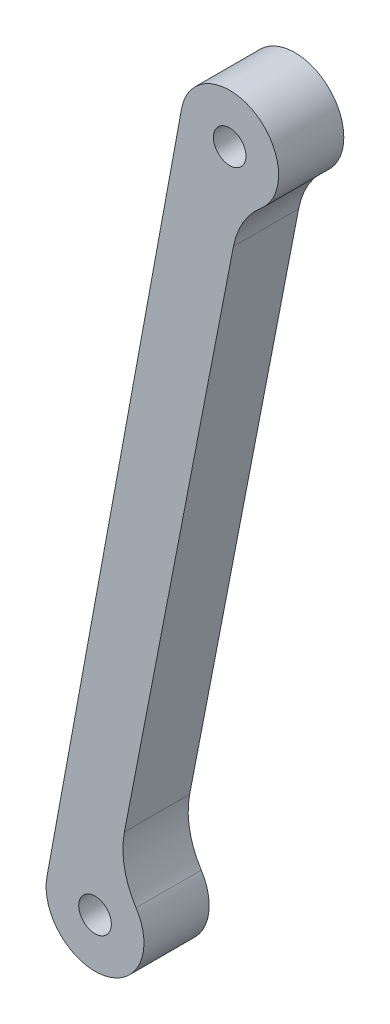
ISO-10303-21;
HEADER;
FILE_DESCRIPTION(('STEP AP214'),'2;1');
FILE_NAME('part.step','',(''),(''),'','','');
FILE_SCHEMA(('AUTOMOTIVE_DESIGN { 1 0 10303 214 1 1 1 1 }'));
ENDSEC;
DATA;
#1=APPLICATION_CONTEXT('core data for automotive mechanical design processes');
#2=APPLICATION_PROTOCOL_DEFINITION('international standard','automotive_design',2000,#1);
#3=PRODUCT_CONTEXT('',#1,'mechanical');
#4=PRODUCT('Part','Part','',(#3));
#5=PRODUCT_RELATED_PRODUCT_CATEGORY('part','',(#4));
#6=PRODUCT_DEFINITION_FORMATION('','',#4);
#7=PRODUCT_DEFINITION_CONTEXT('part definition',#1,'design');
#8=PRODUCT_DEFINITION('design','',#6,#7);
#9=PRODUCT_DEFINITION_SHAPE('','',#8);
#10=(LENGTH_UNIT() NAMED_UNIT(*) SI_UNIT(.MILLI.,.METRE.));
#11=(NAMED_UNIT(*) PLANE_ANGLE_UNIT() SI_UNIT($,.RADIAN.));
#12=(NAMED_UNIT(*) SI_UNIT($,.STERADIAN.) SOLID_ANGLE_UNIT());
#13=UNCERTAINTY_MEASURE_WITH_UNIT(LENGTH_MEASURE(1.E-05),#10,'distance_accuracy_value','');
#14=(GEOMETRIC_REPRESENTATION_CONTEXT(3) GLOBAL_UNCERTAINTY_ASSIGNED_CONTEXT((#13)) GLOBAL_UNIT_ASSIGNED_CONTEXT((#10,
#11,#12)) REPRESENTATION_CONTEXT('',''));
#15=CARTESIAN_POINT('',(0.,0.,0.));
#16=DIRECTION('',(0.,0.,1.));
#17=DIRECTION('',(1.,0.,0.));
#18=AXIS2_PLACEMENT_3D('',#15,#16,#17);
#19=CARTESIAN_POINT('',(31.2850615359514,81.9192149804247,4.));
#20=DIRECTION('',(0.,0.,-1.));
#21=DIRECTION('',(-1.,0.,0.));
#22=AXIS2_PLACEMENT_3D('',#19,#20,#21);
#23=PLANE('',#22);
#24=CARTESIAN_POINT('',(31.2850615359514,81.9192149804247,4.));
#25=DIRECTION('',(0.,0.,-1.));
#26=DIRECTION('',(-1.,0.,0.));
#27=AXIS2_PLACEMENT_3D('',#24,#25,#26);
#28=CIRCLE('',#27,5.);
#29=CARTESIAN_POINT('',(26.3766543349856,82.871863262587,4.));
#30=VERTEX_POINT('',#29);
#31=CARTESIAN_POINT('',(28.0730585094993,85.75106003967,4.));
#32=VERTEX_POINT('',#31);
#33=EDGE_CURVE('E139',#30,#32,#28,.T.);
#34=ORIENTED_EDGE('',*,*,#33,.T.);
#35=CARTESIAN_POINT('',(26.145856693628,88.0501670752172,4.));
#36=DIRECTION('',(0.,0.,1.));
#37=DIRECTION('',(1.,0.,0.));
#38=AXIS2_PLACEMENT_3D('',#35,#36,#37);
#39=CIRCLE('',#38,3.);
#40=CARTESIAN_POINT('',(23.1952741449533,88.592442488136,4.));
#41=VERTEX_POINT('',#40);
#42=EDGE_CURVE('E97',#32,#41,#39,.T.);
#43=ORIENTED_EDGE('',*,*,#42,.T.);
#44=DIRECTION('',(-0.180758470972937,-0.983527516224903,0.));
#45=VECTOR('',#44,1.);
#46=CARTESIAN_POINT('',(14.9394943531754,43.6718003218127,4.));
#47=LINE('',#46,#45);
#48=CARTESIAN_POINT('',(14.9394943531754,43.6718003218127,4.));
#49=VERTEX_POINT('',#48);
#50=EDGE_CURVE('E110',#41,#49,#47,.T.);
#51=ORIENTED_EDGE('',*,*,#50,.T.);
#52=CARTESIAN_POINT('',(17.8900769018501,43.1295249088939,4.));
#53=DIRECTION('',(0.,0.,1.));
#54=DIRECTION('',(1.,0.,0.));
#55=AXIS2_PLACEMENT_3D('',#52,#53,#54);
#56=CIRCLE('',#55,3.);
#57=CARTESIAN_POINT('',(20.406889033319,44.7622088020254,4.));
#58=VERTEX_POINT('',#57);
#59=EDGE_CURVE('E104',#49,#58,#56,.T.);
#60=ORIENTED_EDGE('',*,*,#59,.T.);
#61=CARTESIAN_POINT('',(24.6015759191005,47.4833486239112,4.));
#62=DIRECTION('',(0.,0.,-1.));
#63=DIRECTION('',(1.,0.,0.));
#64=AXIS2_PLACEMENT_3D('',#61,#62,#63);
#65=CIRCLE('',#64,5.);
#66=CARTESIAN_POINT('',(19.6931687181346,48.4359969060735,4.));
#67=VERTEX_POINT('',#66);
#68=EDGE_CURVE('E108',#58,#67,#65,.T.);
#69=ORIENTED_EDGE('',*,*,#68,.T.);
#70=DIRECTION('',(0.190529656432457,0.981681440193166,0.));
#71=VECTOR('',#70,1.);
#72=CARTESIAN_POINT('',(19.6931687181346,48.4359969060735,4.));
#73=LINE('',#72,#71);
#74=EDGE_CURVE('E60',#67,#30,#73,.T.);
#75=ORIENTED_EDGE('',*,*,#74,.T.);
#76=EDGE_LOOP('',(#34,#43,#51,#60,#69,#75));
#77=FACE_BOUND('',#76,.T.);
#78=CARTESIAN_POINT('',(17.8900769018501,43.1295249088939,4.));
#79=DIRECTION('',(0.,0.,1.));
#80=DIRECTION('',(1.,0.,0.));
#81=AXIS2_PLACEMENT_3D('',#78,#79,#80);
#82=CIRCLE('',#81,1.);
#83=CARTESIAN_POINT('',(18.8900769018501,43.1295249088939,4.));
#84=VERTEX_POINT('',#83);
#85=EDGE_CURVE('E132',#84,#84,#82,.T.);
#86=ORIENTED_EDGE('',*,*,#85,.F.);
#87=EDGE_LOOP('',(#86));
#88=FACE_BOUND('',#87,.T.);
#89=CARTESIAN_POINT('',(26.145856693628,88.0501670752172,4.));
#90=DIRECTION('',(0.,0.,1.));
#91=DIRECTION('',(1.,0.,0.));
#92=AXIS2_PLACEMENT_3D('',#89,#90,#91);
#93=CIRCLE('',#92,1.);
#94=CARTESIAN_POINT('',(27.145856693628,88.0501670752172,4.));
#95=VERTEX_POINT('',#94);
#96=EDGE_CURVE('E180',#95,#95,#93,.T.);
#97=ORIENTED_EDGE('',*,*,#96,.F.);
#98=EDGE_LOOP('',(#97));
#99=FACE_BOUND('',#98,.T.);
#100=ADVANCED_FACE('F43',(#77,#88,#99),#23,.F.);
#101=CARTESIAN_POINT('',(31.2850615359514,81.9192149804247,0.));
#102=DIRECTION('',(0.,0.,-1.));
#103=DIRECTION('',(-1.,0.,0.));
#104=AXIS2_PLACEMENT_3D('',#101,#102,#103);
#105=PLANE('',#104);
#106=CARTESIAN_POINT('',(17.8900769018501,43.1295249088939,0.));
#107=DIRECTION('',(0.,0.,1.));
#108=DIRECTION('',(1.,0.,0.));
#109=AXIS2_PLACEMENT_3D('',#106,#107,#108);
#110=CIRCLE('',#109,1.);
#111=CARTESIAN_POINT('',(18.8900769018501,43.1295249088939,0.));
#112=VERTEX_POINT('',#111);
#113=EDGE_CURVE('E185',#112,#112,#110,.T.);
#114=ORIENTED_EDGE('',*,*,#113,.T.);
#115=EDGE_LOOP('',(#114));
#116=FACE_BOUND('',#115,.T.);
#117=CARTESIAN_POINT('',(31.2850615359514,81.9192149804247,0.));
#118=DIRECTION('',(0.,0.,-1.));
#119=DIRECTION('',(-1.,0.,0.));
#120=AXIS2_PLACEMENT_3D('',#117,#118,#119);
#121=CIRCLE('',#120,5.);
#122=CARTESIAN_POINT('',(26.3766543349856,82.871863262587,0.));
#123=VERTEX_POINT('',#122);
#124=CARTESIAN_POINT('',(28.0730585094993,85.75106003967,0.));
#125=VERTEX_POINT('',#124);
#126=EDGE_CURVE('E128',#123,#125,#121,.T.);
#127=ORIENTED_EDGE('',*,*,#126,.F.);
#128=DIRECTION('',(0.190529656432457,0.981681440193166,0.));
#129=VECTOR('',#128,1.);
#130=CARTESIAN_POINT('',(19.6931687181346,48.4359969060735,0.));
#131=LINE('',#130,#129);
#132=CARTESIAN_POINT('',(19.6931687181346,48.4359969060735,0.));
#133=VERTEX_POINT('',#132);
#134=EDGE_CURVE('E89',#133,#123,#131,.T.);
#135=ORIENTED_EDGE('',*,*,#134,.F.);
#136=CARTESIAN_POINT('',(24.6015759191005,47.4833486239112,0.));
#137=DIRECTION('',(0.,0.,-1.));
#138=DIRECTION('',(1.,0.,0.));
#139=AXIS2_PLACEMENT_3D('',#136,#137,#138);
#140=CIRCLE('',#139,5.);
#141=CARTESIAN_POINT('',(20.406889033319,44.7622088020254,0.));
#142=VERTEX_POINT('',#141);
#143=EDGE_CURVE('E83',#142,#133,#140,.T.);
#144=ORIENTED_EDGE('',*,*,#143,.F.);
#145=CARTESIAN_POINT('',(17.8900769018501,43.1295249088939,0.));
#146=DIRECTION('',(0.,0.,1.));
#147=DIRECTION('',(1.,0.,0.));
#148=AXIS2_PLACEMENT_3D('',#145,#146,#147);
#149=CIRCLE('',#148,3.);
#150=CARTESIAN_POINT('',(14.9394943531754,43.6718003218127,0.));
#151=VERTEX_POINT('',#150);
#152=EDGE_CURVE('E118',#151,#142,#149,.T.);
#153=ORIENTED_EDGE('',*,*,#152,.F.);
#154=DIRECTION('',(-0.180758470972937,-0.983527516224903,0.));
#155=VECTOR('',#154,1.);
#156=CARTESIAN_POINT('',(14.9394943531754,43.6718003218127,0.));
#157=LINE('',#156,#155);
#158=CARTESIAN_POINT('',(23.1952741449533,88.592442488136,0.));
#159=VERTEX_POINT('',#158);
#160=EDGE_CURVE('E134',#159,#151,#157,.T.);
#161=ORIENTED_EDGE('',*,*,#160,.F.);
#162=CARTESIAN_POINT('',(26.145856693628,88.0501670752172,0.));
#163=DIRECTION('',(0.,0.,1.));
#164=DIRECTION('',(1.,0.,0.));
#165=AXIS2_PLACEMENT_3D('',#162,#163,#164);
#166=CIRCLE('',#165,3.);
#167=EDGE_CURVE('E131',#125,#159,#166,.T.);
#168=ORIENTED_EDGE('',*,*,#167,.F.);
#169=EDGE_LOOP('',(#127,#135,#144,#153,#161,#168));
#170=FACE_BOUND('',#169,.T.);
#171=CARTESIAN_POINT('',(26.145856693628,88.0501670752172,0.));
#172=DIRECTION('',(0.,0.,1.));
#173=DIRECTION('',(1.,0.,0.));
#174=AXIS2_PLACEMENT_3D('',#171,#172,#173);
#175=CIRCLE('',#174,1.);
#176=CARTESIAN_POINT('',(27.145856693628,88.0501670752172,0.));
#177=VERTEX_POINT('',#176);
#178=EDGE_CURVE('E183',#177,#177,#175,.T.);
#179=ORIENTED_EDGE('',*,*,#178,.T.);
#180=EDGE_LOOP('',(#179));
#181=FACE_BOUND('',#180,.T.);
#182=ADVANCED_FACE('F148',(#116,#170,#181),#105,.T.);
#183=CARTESIAN_POINT('',(31.2850615359514,81.9192149804247,4.));
#184=DIRECTION('',(0.,0.,-1.));
#185=DIRECTION('',(-1.,0.,0.));
#186=AXIS2_PLACEMENT_3D('',#183,#184,#185);
#187=CYLINDRICAL_SURFACE('',#186,5.);
#188=ORIENTED_EDGE('',*,*,#126,.T.);
#189=DIRECTION('',(0.,0.,-1.));
#190=VECTOR('',#189,1.);
#191=CARTESIAN_POINT('',(28.0730585094993,85.75106003967,4.));
#192=LINE('',#191,#190);
#193=EDGE_CURVE('E13',#32,#125,#192,.T.);
#194=ORIENTED_EDGE('',*,*,#193,.F.);
#195=ORIENTED_EDGE('',*,*,#33,.F.);
#196=DIRECTION('',(0.,0.,-1.));
#197=VECTOR('',#196,1.);
#198=CARTESIAN_POINT('',(26.3766543349856,82.871863262587,4.));
#199=LINE('',#198,#197);
#200=EDGE_CURVE('E124',#30,#123,#199,.T.);
#201=ORIENTED_EDGE('',*,*,#200,.T.);
#202=EDGE_LOOP('',(#188,#194,#195,#201));
#203=FACE_BOUND('',#202,.T.);
#204=ADVANCED_FACE('F45',(#203),#187,.F.);
#205=CARTESIAN_POINT('',(26.145856693628,88.0501670752172,4.));
#206=DIRECTION('',(0.,0.,-1.));
#207=DIRECTION('',(-1.,0.,0.));
#208=AXIS2_PLACEMENT_3D('',#205,#206,#207);
#209=CYLINDRICAL_SURFACE('',#208,3.);
#210=ORIENTED_EDGE('',*,*,#167,.T.);
#211=DIRECTION('',(0.,0.,-1.));
#212=VECTOR('',#211,1.);
#213=CARTESIAN_POINT('',(23.1952741449533,88.592442488136,4.));
#214=LINE('',#213,#212);
#215=EDGE_CURVE('E52',#41,#159,#214,.T.);
#216=ORIENTED_EDGE('',*,*,#215,.F.);
#217=ORIENTED_EDGE('',*,*,#42,.F.);
#218=ORIENTED_EDGE('',*,*,#193,.T.);
#219=EDGE_LOOP('',(#210,#216,#217,#218));
#220=FACE_BOUND('',#219,.T.);
#221=ADVANCED_FACE('F228',(#220),#209,.T.);
#222=CARTESIAN_POINT('',(14.9394943531754,43.6718003218127,4.));
#223=DIRECTION('',(0.983527516224903,-0.180758470972937,0.));
#224=DIRECTION('',(0.180758470972937,0.983527516224903,0.));
#225=AXIS2_PLACEMENT_3D('',#222,#223,#224);
#226=PLANE('',#225);
#227=ORIENTED_EDGE('',*,*,#160,.T.);
#228=DIRECTION('',(0.,0.,-1.));
#229=VECTOR('',#228,1.);
#230=CARTESIAN_POINT('',(14.9394943531754,43.6718003218127,4.));
#231=LINE('',#230,#229);
#232=EDGE_CURVE('E119',#49,#151,#231,.T.);
#233=ORIENTED_EDGE('',*,*,#232,.F.);
#234=ORIENTED_EDGE('',*,*,#50,.F.);
#235=ORIENTED_EDGE('',*,*,#215,.T.);
#236=EDGE_LOOP('',(#227,#233,#234,#235));
#237=FACE_BOUND('',#236,.T.);
#238=ADVANCED_FACE('F145',(#237),#226,.F.);
#239=CARTESIAN_POINT('',(17.8900769018501,43.1295249088939,4.));
#240=DIRECTION('',(0.,0.,-1.));
#241=DIRECTION('',(-1.,0.,0.));
#242=AXIS2_PLACEMENT_3D('',#239,#240,#241);
#243=CYLINDRICAL_SURFACE('',#242,3.);
#244=ORIENTED_EDGE('',*,*,#152,.T.);
#245=DIRECTION('',(0.,0.,-1.));
#246=VECTOR('',#245,1.);
#247=CARTESIAN_POINT('',(20.406889033319,44.7622088020254,4.));
#248=LINE('',#247,#246);
#249=EDGE_CURVE('E115',#58,#142,#248,.T.);
#250=ORIENTED_EDGE('',*,*,#249,.F.);
#251=ORIENTED_EDGE('',*,*,#59,.F.);
#252=ORIENTED_EDGE('',*,*,#232,.T.);
#253=EDGE_LOOP('',(#244,#250,#251,#252));
#254=FACE_BOUND('',#253,.T.);
#255=ADVANCED_FACE('F116',(#254),#243,.T.);
#256=CARTESIAN_POINT('',(24.6015759191005,47.4833486239112,4.));
#257=DIRECTION('',(0.,0.,-1.));
#258=DIRECTION('',(-1.,0.,0.));
#259=AXIS2_PLACEMENT_3D('',#256,#257,#258);
#260=CYLINDRICAL_SURFACE('',#259,5.);
#261=ORIENTED_EDGE('',*,*,#143,.T.);
#262=DIRECTION('',(0.,0.,-1.));
#263=VECTOR('',#262,1.);
#264=CARTESIAN_POINT('',(19.6931687181346,48.4359969060735,4.));
#265=LINE('',#264,#263);
#266=EDGE_CURVE('E120',#67,#133,#265,.T.);
#267=ORIENTED_EDGE('',*,*,#266,.F.);
#268=ORIENTED_EDGE('',*,*,#68,.F.);
#269=ORIENTED_EDGE('',*,*,#249,.T.);
#270=EDGE_LOOP('',(#261,#267,#268,#269));
#271=FACE_BOUND('',#270,.T.);
#272=ADVANCED_FACE('F122',(#271),#260,.F.);
#273=CARTESIAN_POINT('',(19.6931687181346,48.4359969060735,4.));
#274=DIRECTION('',(-0.981681440193167,0.190529656432457,0.));
#275=DIRECTION('',(-0.190529656432457,-0.981681440193167,0.));
#276=AXIS2_PLACEMENT_3D('',#273,#274,#275);
#277=PLANE('',#276);
#278=ORIENTED_EDGE('',*,*,#134,.T.);
#279=ORIENTED_EDGE('',*,*,#200,.F.);
#280=ORIENTED_EDGE('',*,*,#74,.F.);
#281=ORIENTED_EDGE('',*,*,#266,.T.);
#282=EDGE_LOOP('',(#278,#279,#280,#281));
#283=FACE_BOUND('',#282,.T.);
#284=ADVANCED_FACE('F153',(#283),#277,.F.);
#285=CARTESIAN_POINT('',(17.8900769018501,43.1295249088939,4.));
#286=DIRECTION('',(0.,0.,-1.));
#287=DIRECTION('',(-1.,0.,0.));
#288=AXIS2_PLACEMENT_3D('',#285,#286,#287);
#289=CYLINDRICAL_SURFACE('',#288,1.);
#290=ORIENTED_EDGE('',*,*,#85,.T.);
#291=EDGE_LOOP('',(#290));
#292=FACE_BOUND('',#291,.T.);
#293=ORIENTED_EDGE('',*,*,#113,.F.);
#294=EDGE_LOOP('',(#293));
#295=FACE_BOUND('',#294,.T.);
#296=ADVANCED_FACE('F155',(#292,#295),#289,.F.);
#297=CARTESIAN_POINT('',(26.145856693628,88.0501670752172,4.));
#298=DIRECTION('',(0.,0.,-1.));
#299=DIRECTION('',(-1.,0.,0.));
#300=AXIS2_PLACEMENT_3D('',#297,#298,#299);
#301=CYLINDRICAL_SURFACE('',#300,1.);
#302=ORIENTED_EDGE('',*,*,#96,.T.);
#303=EDGE_LOOP('',(#302));
#304=FACE_BOUND('',#303,.T.);
#305=ORIENTED_EDGE('',*,*,#178,.F.);
#306=EDGE_LOOP('',(#305));
#307=FACE_BOUND('',#306,.T.);
#308=ADVANCED_FACE('F161',(#304,#307),#301,.F.);
#309=CLOSED_SHELL('',(#100,#182,#204,#221,#238,#255,#272,#284,#296,#308));
#310=MANIFOLD_SOLID_BREP('B2',#309);
#311=ADVANCED_BREP_SHAPE_REPRESENTATION('',(#18,#310),#14);
#312=SHAPE_DEFINITION_REPRESENTATION(#9,#311);
ENDSEC;
END-ISO-10303-21;
